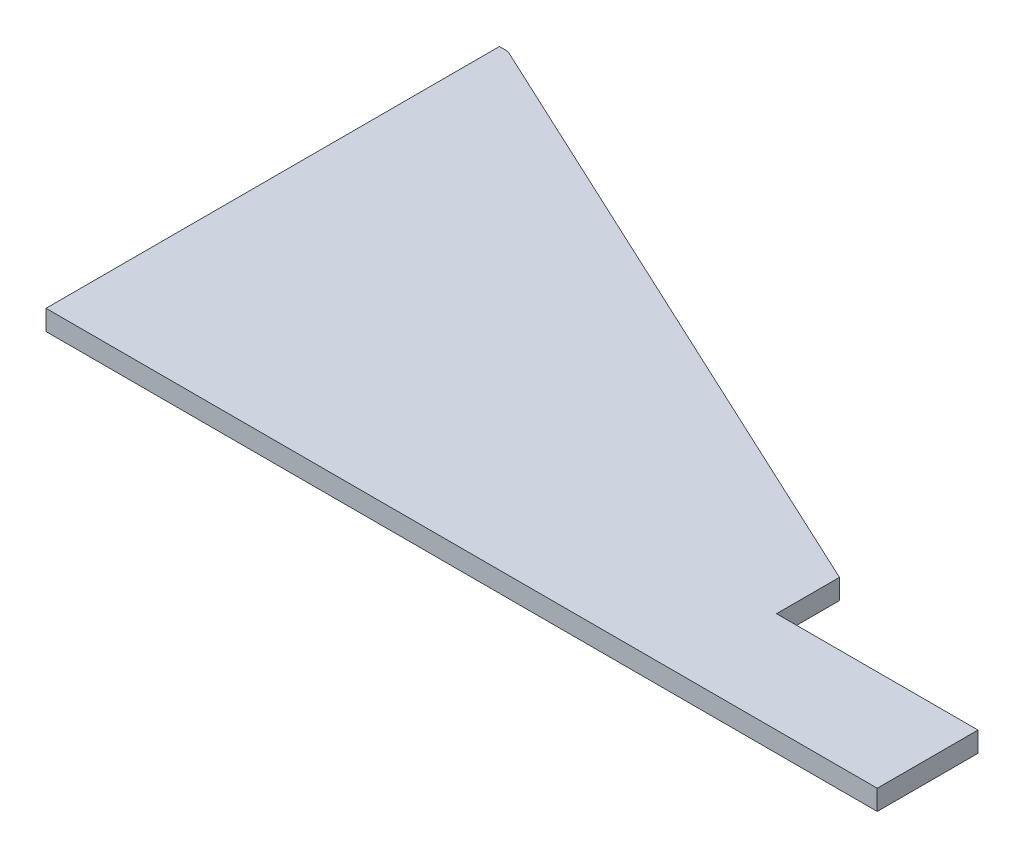
ISO-10303-21;
HEADER;
FILE_DESCRIPTION(('STEP AP214'),'2;1');
FILE_NAME('part.step','',(''),(''),'','','');
FILE_SCHEMA(('AUTOMOTIVE_DESIGN { 1 0 10303 214 1 1 1 1 }'));
ENDSEC;
DATA;
#1=APPLICATION_CONTEXT('core data for automotive mechanical design processes');
#2=APPLICATION_PROTOCOL_DEFINITION('international standard','automotive_design',2000,#1);
#3=PRODUCT_CONTEXT('',#1,'mechanical');
#4=PRODUCT('Part','Part','',(#3));
#5=PRODUCT_RELATED_PRODUCT_CATEGORY('part','',(#4));
#6=PRODUCT_DEFINITION_FORMATION('','',#4);
#7=PRODUCT_DEFINITION_CONTEXT('part definition',#1,'design');
#8=PRODUCT_DEFINITION('design','',#6,#7);
#9=PRODUCT_DEFINITION_SHAPE('','',#8);
#10=(LENGTH_UNIT() NAMED_UNIT(*) SI_UNIT(.MILLI.,.METRE.));
#11=(NAMED_UNIT(*) PLANE_ANGLE_UNIT() SI_UNIT($,.RADIAN.));
#12=(NAMED_UNIT(*) SI_UNIT($,.STERADIAN.) SOLID_ANGLE_UNIT());
#13=UNCERTAINTY_MEASURE_WITH_UNIT(LENGTH_MEASURE(1.E-05),#10,'distance_accuracy_value','');
#14=(GEOMETRIC_REPRESENTATION_CONTEXT(3) GLOBAL_UNCERTAINTY_ASSIGNED_CONTEXT((#13)) GLOBAL_UNIT_ASSIGNED_CONTEXT((#10,
#11,#12)) REPRESENTATION_CONTEXT('',''));
#15=CARTESIAN_POINT('',(0.,0.,0.));
#16=DIRECTION('',(0.,0.,1.));
#17=DIRECTION('',(1.,0.,0.));
#18=AXIS2_PLACEMENT_3D('',#15,#16,#17);
#19=CARTESIAN_POINT('',(0.,8.,-180.));
#20=DIRECTION('',(1.,0.,0.));
#21=DIRECTION('',(0.,0.,-1.));
#22=AXIS2_PLACEMENT_3D('',#19,#20,#21);
#23=PLANE('',#22);
#24=DIRECTION('',(0.,0.,1.));
#25=VECTOR('',#24,1.);
#26=CARTESIAN_POINT('',(0.,0.,-180.));
#27=LINE('',#26,#25);
#28=CARTESIAN_POINT('',(0.,0.,-180.));
#29=VERTEX_POINT('',#28);
#30=CARTESIAN_POINT('',(0.,0.,0.));
#31=VERTEX_POINT('',#30);
#32=EDGE_CURVE('E134',#29,#31,#27,.T.);
#33=ORIENTED_EDGE('',*,*,#32,.T.);
#34=DIRECTION('',(0.,-1.,0.));
#35=VECTOR('',#34,1.);
#36=CARTESIAN_POINT('',(0.,8.,0.));
#37=LINE('',#36,#35);
#38=CARTESIAN_POINT('',(0.,8.,0.));
#39=VERTEX_POINT('',#38);
#40=EDGE_CURVE('E11',#39,#31,#37,.T.);
#41=ORIENTED_EDGE('',*,*,#40,.F.);
#42=DIRECTION('',(0.,0.,1.));
#43=VECTOR('',#42,1.);
#44=CARTESIAN_POINT('',(0.,8.,-180.));
#45=LINE('',#44,#43);
#46=CARTESIAN_POINT('',(0.,8.,-180.));
#47=VERTEX_POINT('',#46);
#48=EDGE_CURVE('E153',#47,#39,#45,.T.);
#49=ORIENTED_EDGE('',*,*,#48,.F.);
#50=DIRECTION('',(0.,-1.,0.));
#51=VECTOR('',#50,1.);
#52=CARTESIAN_POINT('',(0.,8.,-180.));
#53=LINE('',#52,#51);
#54=EDGE_CURVE('E130',#47,#29,#53,.T.);
#55=ORIENTED_EDGE('',*,*,#54,.T.);
#56=EDGE_LOOP('',(#33,#41,#49,#55));
#57=FACE_BOUND('',#56,.T.);
#58=ADVANCED_FACE('F39',(#57),#23,.F.);
#59=CARTESIAN_POINT('',(0.,8.,0.));
#60=DIRECTION('',(0.,0.,-1.));
#61=DIRECTION('',(-1.,0.,0.));
#62=AXIS2_PLACEMENT_3D('',#59,#60,#61);
#63=PLANE('',#62);
#64=DIRECTION('',(1.,0.,0.));
#65=VECTOR('',#64,1.);
#66=CARTESIAN_POINT('',(0.,0.,0.));
#67=LINE('',#66,#65);
#68=CARTESIAN_POINT('',(330.,0.,0.));
#69=VERTEX_POINT('',#68);
#70=EDGE_CURVE('E138',#31,#69,#67,.T.);
#71=ORIENTED_EDGE('',*,*,#70,.T.);
#72=DIRECTION('',(0.,-1.,0.));
#73=VECTOR('',#72,1.);
#74=CARTESIAN_POINT('',(330.,8.,0.));
#75=LINE('',#74,#73);
#76=CARTESIAN_POINT('',(330.,8.,0.));
#77=VERTEX_POINT('',#76);
#78=EDGE_CURVE('E48',#77,#69,#75,.T.);
#79=ORIENTED_EDGE('',*,*,#78,.F.);
#80=DIRECTION('',(1.,0.,0.));
#81=VECTOR('',#80,1.);
#82=CARTESIAN_POINT('',(0.,8.,0.));
#83=LINE('',#82,#81);
#84=EDGE_CURVE('E96',#39,#77,#83,.T.);
#85=ORIENTED_EDGE('',*,*,#84,.F.);
#86=ORIENTED_EDGE('',*,*,#40,.T.);
#87=EDGE_LOOP('',(#71,#79,#85,#86));
#88=FACE_BOUND('',#87,.T.);
#89=ADVANCED_FACE('F187',(#88),#63,.F.);
#90=CARTESIAN_POINT('',(330.,8.,0.));
#91=DIRECTION('',(-1.,0.,0.));
#92=DIRECTION('',(0.,0.,1.));
#93=AXIS2_PLACEMENT_3D('',#90,#91,#92);
#94=PLANE('',#93);
#95=DIRECTION('',(0.,0.,-1.));
#96=VECTOR('',#95,1.);
#97=CARTESIAN_POINT('',(330.,0.,0.));
#98=LINE('',#97,#96);
#99=CARTESIAN_POINT('',(330.,0.,-40.));
#100=VERTEX_POINT('',#99);
#101=EDGE_CURVE('E141',#69,#100,#98,.T.);
#102=ORIENTED_EDGE('',*,*,#101,.T.);
#103=DIRECTION('',(0.,-1.,0.));
#104=VECTOR('',#103,1.);
#105=CARTESIAN_POINT('',(330.,8.,-40.));
#106=LINE('',#105,#104);
#107=CARTESIAN_POINT('',(330.,8.,-40.));
#108=VERTEX_POINT('',#107);
#109=EDGE_CURVE('E160',#108,#100,#106,.T.);
#110=ORIENTED_EDGE('',*,*,#109,.F.);
#111=DIRECTION('',(0.,0.,-1.));
#112=VECTOR('',#111,1.);
#113=CARTESIAN_POINT('',(330.,8.,0.));
#114=LINE('',#113,#112);
#115=EDGE_CURVE('E170',#77,#108,#114,.T.);
#116=ORIENTED_EDGE('',*,*,#115,.F.);
#117=ORIENTED_EDGE('',*,*,#78,.T.);
#118=EDGE_LOOP('',(#102,#110,#116,#117));
#119=FACE_BOUND('',#118,.T.);
#120=ADVANCED_FACE('F168',(#119),#94,.F.);
#121=CARTESIAN_POINT('',(330.,8.,-40.));
#122=DIRECTION('',(0.,0.,1.));
#123=DIRECTION('',(1.,0.,0.));
#124=AXIS2_PLACEMENT_3D('',#121,#122,#123);
#125=PLANE('',#124);
#126=DIRECTION('',(-1.,0.,0.));
#127=VECTOR('',#126,1.);
#128=CARTESIAN_POINT('',(330.,0.,-40.));
#129=LINE('',#128,#127);
#130=CARTESIAN_POINT('',(250.,0.,-40.));
#131=VERTEX_POINT('',#130);
#132=EDGE_CURVE('E144',#100,#131,#129,.T.);
#133=ORIENTED_EDGE('',*,*,#132,.T.);
#134=DIRECTION('',(0.,-1.,0.));
#135=VECTOR('',#134,1.);
#136=CARTESIAN_POINT('',(250.,8.,-40.));
#137=LINE('',#136,#135);
#138=CARTESIAN_POINT('',(250.,8.,-40.));
#139=VERTEX_POINT('',#138);
#140=EDGE_CURVE('E123',#139,#131,#137,.T.);
#141=ORIENTED_EDGE('',*,*,#140,.F.);
#142=DIRECTION('',(-1.,0.,0.));
#143=VECTOR('',#142,1.);
#144=CARTESIAN_POINT('',(330.,8.,-40.));
#145=LINE('',#144,#143);
#146=EDGE_CURVE('E112',#108,#139,#145,.T.);
#147=ORIENTED_EDGE('',*,*,#146,.F.);
#148=ORIENTED_EDGE('',*,*,#109,.T.);
#149=EDGE_LOOP('',(#133,#141,#147,#148));
#150=FACE_BOUND('',#149,.T.);
#151=ADVANCED_FACE('F176',(#150),#125,.F.);
#152=CARTESIAN_POINT('',(250.,8.,-40.));
#153=DIRECTION('',(-1.,0.,0.));
#154=DIRECTION('',(0.,0.,1.));
#155=AXIS2_PLACEMENT_3D('',#152,#153,#154);
#156=PLANE('',#155);
#157=DIRECTION('',(0.,0.,-1.));
#158=VECTOR('',#157,1.);
#159=CARTESIAN_POINT('',(250.,0.,-40.));
#160=LINE('',#159,#158);
#161=CARTESIAN_POINT('',(250.,0.,-65.));
#162=VERTEX_POINT('',#161);
#163=EDGE_CURVE('E121',#131,#162,#160,.T.);
#164=ORIENTED_EDGE('',*,*,#163,.T.);
#165=DIRECTION('',(0.,-1.,0.));
#166=VECTOR('',#165,1.);
#167=CARTESIAN_POINT('',(250.,8.,-65.));
#168=LINE('',#167,#166);
#169=CARTESIAN_POINT('',(250.,8.,-65.));
#170=VERTEX_POINT('',#169);
#171=EDGE_CURVE('E118',#170,#162,#168,.T.);
#172=ORIENTED_EDGE('',*,*,#171,.F.);
#173=DIRECTION('',(0.,0.,-1.));
#174=VECTOR('',#173,1.);
#175=CARTESIAN_POINT('',(250.,8.,-40.));
#176=LINE('',#175,#174);
#177=EDGE_CURVE('E106',#139,#170,#176,.T.);
#178=ORIENTED_EDGE('',*,*,#177,.F.);
#179=ORIENTED_EDGE('',*,*,#140,.T.);
#180=EDGE_LOOP('',(#164,#172,#178,#179));
#181=FACE_BOUND('',#180,.T.);
#182=ADVANCED_FACE('F119',(#181),#156,.F.);
#183=CARTESIAN_POINT('',(250.,8.,-65.));
#184=DIRECTION('',(-0.4226182617407,0.,0.90630778703665));
#185=DIRECTION('',(0.90630778703665,0.,0.4226182617407));
#186=AXIS2_PLACEMENT_3D('',#183,#184,#185);
#187=PLANE('',#186);
#188=DIRECTION('',(-0.90630778703665,0.,-0.4226182617407));
#189=VECTOR('',#188,1.);
#190=CARTESIAN_POINT('',(250.,0.,-65.));
#191=LINE('',#190,#189);
#192=CARTESIAN_POINT('',(3.38170414140118,0.,-180.));
#193=VERTEX_POINT('',#192);
#194=EDGE_CURVE('E82',#162,#193,#191,.T.);
#195=ORIENTED_EDGE('',*,*,#194,.T.);
#196=DIRECTION('',(0.,-1.,0.));
#197=VECTOR('',#196,1.);
#198=CARTESIAN_POINT('',(3.38170414140118,8.,-180.));
#199=LINE('',#198,#197);
#200=CARTESIAN_POINT('',(3.38170414140118,8.,-180.));
#201=VERTEX_POINT('',#200);
#202=EDGE_CURVE('E124',#201,#193,#199,.T.);
#203=ORIENTED_EDGE('',*,*,#202,.F.);
#204=DIRECTION('',(-0.90630778703665,0.,-0.4226182617407));
#205=VECTOR('',#204,1.);
#206=CARTESIAN_POINT('',(250.,8.,-65.));
#207=LINE('',#206,#205);
#208=EDGE_CURVE('E110',#170,#201,#207,.T.);
#209=ORIENTED_EDGE('',*,*,#208,.F.);
#210=ORIENTED_EDGE('',*,*,#171,.T.);
#211=EDGE_LOOP('',(#195,#203,#209,#210));
#212=FACE_BOUND('',#211,.T.);
#213=ADVANCED_FACE('F126',(#212),#187,.F.);
#214=CARTESIAN_POINT('',(3.38170414140118,8.,-180.));
#215=DIRECTION('',(0.,0.,1.));
#216=DIRECTION('',(1.,0.,0.));
#217=AXIS2_PLACEMENT_3D('',#214,#215,#216);
#218=PLANE('',#217);
#219=DIRECTION('',(-1.,0.,0.));
#220=VECTOR('',#219,1.);
#221=CARTESIAN_POINT('',(3.38170414140118,0.,-180.));
#222=LINE('',#221,#220);
#223=EDGE_CURVE('E88',#193,#29,#222,.T.);
#224=ORIENTED_EDGE('',*,*,#223,.T.);
#225=ORIENTED_EDGE('',*,*,#54,.F.);
#226=DIRECTION('',(-1.,0.,0.));
#227=VECTOR('',#226,1.);
#228=CARTESIAN_POINT('',(3.38170414140118,8.,-180.));
#229=LINE('',#228,#227);
#230=EDGE_CURVE('E56',#201,#47,#229,.T.);
#231=ORIENTED_EDGE('',*,*,#230,.F.);
#232=ORIENTED_EDGE('',*,*,#202,.T.);
#233=EDGE_LOOP('',(#224,#225,#231,#232));
#234=FACE_BOUND('',#233,.T.);
#235=ADVANCED_FACE('F201',(#234),#218,.F.);
#236=CARTESIAN_POINT('',(0.,8.,0.));
#237=DIRECTION('',(0.,1.,0.));
#238=DIRECTION('',(0.,0.,1.));
#239=AXIS2_PLACEMENT_3D('',#236,#237,#238);
#240=PLANE('',#239);
#241=ORIENTED_EDGE('',*,*,#48,.T.);
#242=ORIENTED_EDGE('',*,*,#84,.T.);
#243=ORIENTED_EDGE('',*,*,#115,.T.);
#244=ORIENTED_EDGE('',*,*,#146,.T.);
#245=ORIENTED_EDGE('',*,*,#177,.T.);
#246=ORIENTED_EDGE('',*,*,#208,.T.);
#247=ORIENTED_EDGE('',*,*,#230,.T.);
#248=EDGE_LOOP('',(#241,#242,#243,#244,#245,#246,#247));
#249=FACE_BOUND('',#248,.T.);
#250=ADVANCED_FACE('F108',(#249),#240,.T.);
#251=CARTESIAN_POINT('',(0.,0.,0.));
#252=DIRECTION('',(0.,1.,0.));
#253=DIRECTION('',(0.,0.,1.));
#254=AXIS2_PLACEMENT_3D('',#251,#252,#253);
#255=PLANE('',#254);
#256=ORIENTED_EDGE('',*,*,#32,.F.);
#257=ORIENTED_EDGE('',*,*,#223,.F.);
#258=ORIENTED_EDGE('',*,*,#194,.F.);
#259=ORIENTED_EDGE('',*,*,#163,.F.);
#260=ORIENTED_EDGE('',*,*,#132,.F.);
#261=ORIENTED_EDGE('',*,*,#101,.F.);
#262=ORIENTED_EDGE('',*,*,#70,.F.);
#263=EDGE_LOOP('',(#256,#257,#258,#259,#260,#261,#262));
#264=FACE_BOUND('',#263,.T.);
#265=ADVANCED_FACE('F174',(#264),#255,.F.);
#266=CLOSED_SHELL('',(#58,#89,#120,#151,#182,#213,#235,#250,#265));
#267=MANIFOLD_SOLID_BREP('B2',#266);
#268=ADVANCED_BREP_SHAPE_REPRESENTATION('',(#18,#267),#14);
#269=SHAPE_DEFINITION_REPRESENTATION(#9,#268);
ENDSEC;
END-ISO-10303-21;
